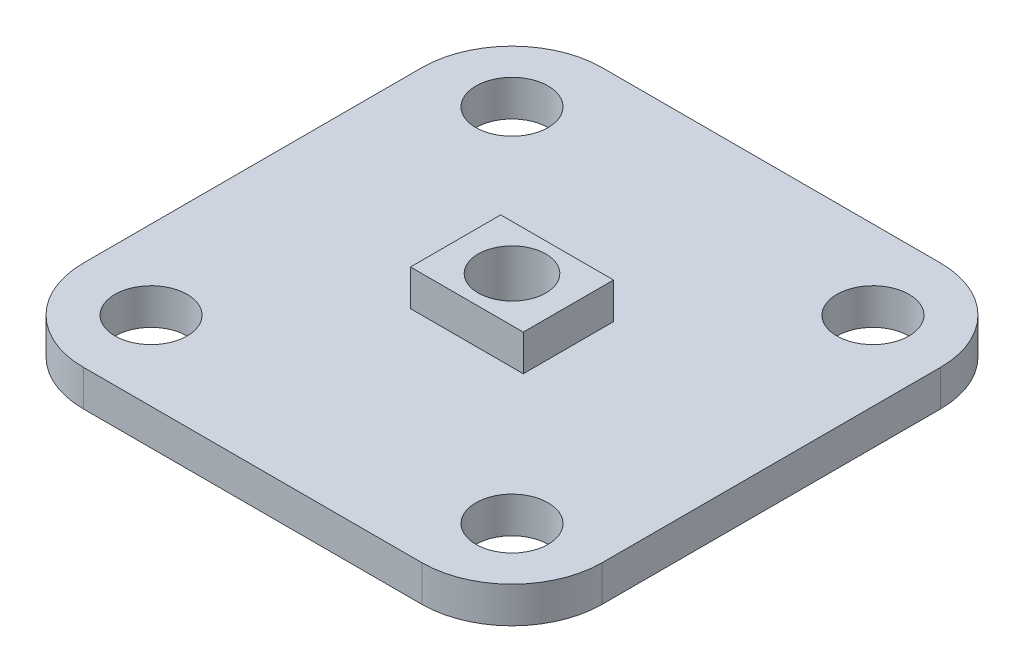
ISO-10303-21;
HEADER;
FILE_DESCRIPTION(('STEP AP214'),'2;1');
FILE_NAME('part.step','',(''),(''),'','','');
FILE_SCHEMA(('AUTOMOTIVE_DESIGN { 1 0 10303 214 1 1 1 1 }'));
ENDSEC;
DATA;
#1=APPLICATION_CONTEXT('core data for automotive mechanical design processes');
#2=APPLICATION_PROTOCOL_DEFINITION('international standard','automotive_design',2000,#1);
#3=PRODUCT_CONTEXT('',#1,'mechanical');
#4=PRODUCT('Part','Part','',(#3));
#5=PRODUCT_RELATED_PRODUCT_CATEGORY('part','',(#4));
#6=PRODUCT_DEFINITION_FORMATION('','',#4);
#7=PRODUCT_DEFINITION_CONTEXT('part definition',#1,'design');
#8=PRODUCT_DEFINITION('design','',#6,#7);
#9=PRODUCT_DEFINITION_SHAPE('','',#8);
#10=(LENGTH_UNIT() NAMED_UNIT(*) SI_UNIT(.MILLI.,.METRE.));
#11=(NAMED_UNIT(*) PLANE_ANGLE_UNIT() SI_UNIT($,.RADIAN.));
#12=(NAMED_UNIT(*) SI_UNIT($,.STERADIAN.) SOLID_ANGLE_UNIT());
#13=UNCERTAINTY_MEASURE_WITH_UNIT(LENGTH_MEASURE(1.E-05),#10,'distance_accuracy_value','');
#14=(GEOMETRIC_REPRESENTATION_CONTEXT(3) GLOBAL_UNCERTAINTY_ASSIGNED_CONTEXT((#13)) GLOBAL_UNIT_ASSIGNED_CONTEXT((#10,
#11,#12)) REPRESENTATION_CONTEXT('',''));
#15=CARTESIAN_POINT('',(0.,0.,0.));
#16=DIRECTION('',(0.,0.,1.));
#17=DIRECTION('',(1.,0.,0.));
#18=AXIS2_PLACEMENT_3D('',#15,#16,#17);
#19=CARTESIAN_POINT('',(0.,1.6,0.));
#20=DIRECTION('',(0.,-1.,0.));
#21=DIRECTION('',(0.,0.,-1.));
#22=AXIS2_PLACEMENT_3D('',#19,#20,#21);
#23=PLANE('',#22);
#24=CARTESIAN_POINT('',(-8.,1.6,-8.));
#25=DIRECTION('',(0.,-1.,0.));
#26=DIRECTION('',(0.,0.,-1.));
#27=AXIS2_PLACEMENT_3D('',#24,#25,#26);
#28=CIRCLE('',#27,1.60000000000011);
#29=CARTESIAN_POINT('',(-8.,1.6,-9.60000000000011));
#30=VERTEX_POINT('',#29);
#31=EDGE_CURVE('E490',#30,#30,#28,.F.);
#32=ORIENTED_EDGE('',*,*,#31,.F.);
#33=EDGE_LOOP('',(#32));
#34=FACE_BOUND('',#33,.T.);
#35=CARTESIAN_POINT('',(8.,1.6,-8.));
#36=DIRECTION('',(0.,-1.,0.));
#37=DIRECTION('',(0.,0.,-1.));
#38=AXIS2_PLACEMENT_3D('',#35,#36,#37);
#39=CIRCLE('',#38,1.60000000000007);
#40=CARTESIAN_POINT('',(8.,1.6,-9.60000000000007));
#41=VERTEX_POINT('',#40);
#42=EDGE_CURVE('E489',#41,#41,#39,.F.);
#43=ORIENTED_EDGE('',*,*,#42,.F.);
#44=EDGE_LOOP('',(#43));
#45=FACE_BOUND('',#44,.T.);
#46=CARTESIAN_POINT('',(8.,1.6,8.));
#47=DIRECTION('',(0.,-1.,0.));
#48=DIRECTION('',(0.,0.,-1.));
#49=AXIS2_PLACEMENT_3D('',#46,#47,#48);
#50=CIRCLE('',#49,1.60000000000004);
#51=CARTESIAN_POINT('',(8.,1.6,6.39999999999996));
#52=VERTEX_POINT('',#51);
#53=EDGE_CURVE('E497',#52,#52,#50,.F.);
#54=ORIENTED_EDGE('',*,*,#53,.F.);
#55=EDGE_LOOP('',(#54));
#56=FACE_BOUND('',#55,.T.);
#57=CARTESIAN_POINT('',(-8.,1.6,8.));
#58=DIRECTION('',(0.,-1.,0.));
#59=DIRECTION('',(0.,0.,-1.));
#60=AXIS2_PLACEMENT_3D('',#57,#58,#59);
#61=CIRCLE('',#60,1.6);
#62=CARTESIAN_POINT('',(-8.,1.6,6.4));
#63=VERTEX_POINT('',#62);
#64=EDGE_CURVE('E477',#63,#63,#61,.F.);
#65=ORIENTED_EDGE('',*,*,#64,.F.);
#66=EDGE_LOOP('',(#65));
#67=FACE_BOUND('',#66,.T.);
#68=DIRECTION('',(0.,0.,-1.));
#69=VECTOR('',#68,1.);
#70=CARTESIAN_POINT('',(11.5,1.6,11.5));
#71=LINE('',#70,#69);
#72=CARTESIAN_POINT('',(11.5,1.6,7.5));
#73=VERTEX_POINT('',#72);
#74=CARTESIAN_POINT('',(11.5,1.6,-7.5));
#75=VERTEX_POINT('',#74);
#76=EDGE_CURVE('E166',#73,#75,#71,.T.);
#77=ORIENTED_EDGE('',*,*,#76,.T.);
#78=CARTESIAN_POINT('',(7.5,1.6,-7.5));
#79=DIRECTION('',(0.,-1.,0.));
#80=DIRECTION('',(0.,0.,-1.));
#81=AXIS2_PLACEMENT_3D('',#78,#79,#80);
#82=CIRCLE('',#81,4.);
#83=CARTESIAN_POINT('',(7.5,1.6,-11.5));
#84=VERTEX_POINT('',#83);
#85=EDGE_CURVE('E206',#75,#84,#82,.F.);
#86=ORIENTED_EDGE('',*,*,#85,.T.);
#87=DIRECTION('',(-1.,0.,0.));
#88=VECTOR('',#87,1.);
#89=CARTESIAN_POINT('',(-11.5,1.6,-11.5));
#90=LINE('',#89,#88);
#91=CARTESIAN_POINT('',(-7.5,1.6,-11.5));
#92=VERTEX_POINT('',#91);
#93=EDGE_CURVE('E169',#84,#92,#90,.T.);
#94=ORIENTED_EDGE('',*,*,#93,.T.);
#95=CARTESIAN_POINT('',(-7.5,1.6,-7.5));
#96=DIRECTION('',(0.,-1.,0.));
#97=DIRECTION('',(0.,0.,-1.));
#98=AXIS2_PLACEMENT_3D('',#95,#96,#97);
#99=CIRCLE('',#98,4.);
#100=CARTESIAN_POINT('',(-11.5,1.6,-7.5));
#101=VERTEX_POINT('',#100);
#102=EDGE_CURVE('E204',#92,#101,#99,.F.);
#103=ORIENTED_EDGE('',*,*,#102,.T.);
#104=DIRECTION('',(0.,0.,1.));
#105=VECTOR('',#104,1.);
#106=CARTESIAN_POINT('',(-11.5,1.6,11.5));
#107=LINE('',#106,#105);
#108=CARTESIAN_POINT('',(-11.5,1.6,7.5));
#109=VERTEX_POINT('',#108);
#110=EDGE_CURVE('E173',#101,#109,#107,.T.);
#111=ORIENTED_EDGE('',*,*,#110,.T.);
#112=CARTESIAN_POINT('',(-7.5,1.6,7.5));
#113=DIRECTION('',(0.,-1.,0.));
#114=DIRECTION('',(0.,0.,-1.));
#115=AXIS2_PLACEMENT_3D('',#112,#113,#114);
#116=CIRCLE('',#115,4.);
#117=CARTESIAN_POINT('',(-7.5,1.6,11.5));
#118=VERTEX_POINT('',#117);
#119=EDGE_CURVE('E63',#109,#118,#116,.F.);
#120=ORIENTED_EDGE('',*,*,#119,.T.);
#121=DIRECTION('',(1.,0.,0.));
#122=VECTOR('',#121,1.);
#123=CARTESIAN_POINT('',(-11.5,1.6,11.5));
#124=LINE('',#123,#122);
#125=CARTESIAN_POINT('',(7.5,1.6,11.5));
#126=VERTEX_POINT('',#125);
#127=EDGE_CURVE('E175',#118,#126,#124,.T.);
#128=ORIENTED_EDGE('',*,*,#127,.T.);
#129=CARTESIAN_POINT('',(7.5,1.6,7.5));
#130=DIRECTION('',(0.,-1.,0.));
#131=DIRECTION('',(0.,0.,-1.));
#132=AXIS2_PLACEMENT_3D('',#129,#130,#131);
#133=CIRCLE('',#132,4.);
#134=EDGE_CURVE('E202',#126,#73,#133,.F.);
#135=ORIENTED_EDGE('',*,*,#134,.T.);
#136=EDGE_LOOP('',(#77,#86,#94,#103,#111,#120,#128,#135));
#137=FACE_BOUND('',#136,.T.);
#138=DIRECTION('',(0.,0.,-1.));
#139=VECTOR('',#138,1.);
#140=CARTESIAN_POINT('',(2.5,1.6,2.));
#141=LINE('',#140,#139);
#142=CARTESIAN_POINT('',(2.5,1.6,2.));
#143=VERTEX_POINT('',#142);
#144=CARTESIAN_POINT('',(2.5,1.6,-2.));
#145=VERTEX_POINT('',#144);
#146=EDGE_CURVE('E156',#143,#145,#141,.T.);
#147=ORIENTED_EDGE('',*,*,#146,.F.);
#148=DIRECTION('',(1.,0.,0.));
#149=VECTOR('',#148,1.);
#150=CARTESIAN_POINT('',(-2.5,1.6,2.));
#151=LINE('',#150,#149);
#152=CARTESIAN_POINT('',(-2.5,1.6,2.));
#153=VERTEX_POINT('',#152);
#154=EDGE_CURVE('E153',#153,#143,#151,.T.);
#155=ORIENTED_EDGE('',*,*,#154,.F.);
#156=DIRECTION('',(0.,0.,1.));
#157=VECTOR('',#156,1.);
#158=CARTESIAN_POINT('',(-2.5,1.6,2.));
#159=LINE('',#158,#157);
#160=CARTESIAN_POINT('',(-2.5,1.6,-2.));
#161=VERTEX_POINT('',#160);
#162=EDGE_CURVE('E466',#161,#153,#159,.T.);
#163=ORIENTED_EDGE('',*,*,#162,.F.);
#164=DIRECTION('',(-1.,0.,0.));
#165=VECTOR('',#164,1.);
#166=CARTESIAN_POINT('',(-2.5,1.6,-2.));
#167=LINE('',#166,#165);
#168=EDGE_CURVE('E468',#145,#161,#167,.T.);
#169=ORIENTED_EDGE('',*,*,#168,.F.);
#170=EDGE_LOOP('',(#147,#155,#163,#169));
#171=FACE_BOUND('',#170,.T.);
#172=ADVANCED_FACE('F43',(#34,#45,#56,#67,#137,#171),#23,.F.);
#173=CARTESIAN_POINT('',(11.5,1.6,11.5));
#174=DIRECTION('',(-1.,0.,0.));
#175=DIRECTION('',(0.,0.,1.));
#176=AXIS2_PLACEMENT_3D('',#173,#174,#175);
#177=PLANE('',#176);
#178=DIRECTION('',(0.,0.,-1.));
#179=VECTOR('',#178,1.);
#180=CARTESIAN_POINT('',(11.5,0.,11.5));
#181=LINE('',#180,#179);
#182=CARTESIAN_POINT('',(11.5,0.,7.5));
#183=VERTEX_POINT('',#182);
#184=CARTESIAN_POINT('',(11.5,0.,-7.5));
#185=VERTEX_POINT('',#184);
#186=EDGE_CURVE('E157',#183,#185,#181,.T.);
#187=ORIENTED_EDGE('',*,*,#186,.T.);
#188=DIRECTION('',(0.,-1.,0.));
#189=VECTOR('',#188,1.);
#190=CARTESIAN_POINT('',(11.5,1.6,-7.5));
#191=LINE('',#190,#189);
#192=EDGE_CURVE('E199',#185,#75,#191,.F.);
#193=ORIENTED_EDGE('',*,*,#192,.T.);
#194=ORIENTED_EDGE('',*,*,#76,.F.);
#195=DIRECTION('',(0.,-1.,0.));
#196=VECTOR('',#195,1.);
#197=CARTESIAN_POINT('',(11.5,1.6,7.5));
#198=LINE('',#197,#196);
#199=EDGE_CURVE('E196',#73,#183,#198,.T.);
#200=ORIENTED_EDGE('',*,*,#199,.T.);
#201=EDGE_LOOP('',(#187,#193,#194,#200));
#202=FACE_BOUND('',#201,.T.);
#203=ADVANCED_FACE('F228',(#202),#177,.F.);
#204=CARTESIAN_POINT('',(-11.5,1.6,-11.5));
#205=DIRECTION('',(0.,0.,1.));
#206=DIRECTION('',(1.,0.,0.));
#207=AXIS2_PLACEMENT_3D('',#204,#205,#206);
#208=PLANE('',#207);
#209=ORIENTED_EDGE('',*,*,#93,.F.);
#210=DIRECTION('',(0.,-1.,0.));
#211=VECTOR('',#210,1.);
#212=CARTESIAN_POINT('',(7.5,1.6,-11.5));
#213=LINE('',#212,#211);
#214=CARTESIAN_POINT('',(7.5,0.,-11.5));
#215=VERTEX_POINT('',#214);
#216=EDGE_CURVE('E185',#84,#215,#213,.T.);
#217=ORIENTED_EDGE('',*,*,#216,.T.);
#218=DIRECTION('',(-1.,0.,0.));
#219=VECTOR('',#218,1.);
#220=CARTESIAN_POINT('',(-11.5,0.,-11.5));
#221=LINE('',#220,#219);
#222=CARTESIAN_POINT('',(-7.5,0.,-11.5));
#223=VERTEX_POINT('',#222);
#224=EDGE_CURVE('E160',#215,#223,#221,.T.);
#225=ORIENTED_EDGE('',*,*,#224,.T.);
#226=DIRECTION('',(0.,-1.,0.));
#227=VECTOR('',#226,1.);
#228=CARTESIAN_POINT('',(-7.5,1.6,-11.5));
#229=LINE('',#228,#227);
#230=EDGE_CURVE('E176',#223,#92,#229,.F.);
#231=ORIENTED_EDGE('',*,*,#230,.T.);
#232=EDGE_LOOP('',(#209,#217,#225,#231));
#233=FACE_BOUND('',#232,.T.);
#234=ADVANCED_FACE('F237',(#233),#208,.F.);
#235=CARTESIAN_POINT('',(-11.5,1.6,11.5));
#236=DIRECTION('',(1.,0.,0.));
#237=DIRECTION('',(0.,0.,-1.));
#238=AXIS2_PLACEMENT_3D('',#235,#236,#237);
#239=PLANE('',#238);
#240=ORIENTED_EDGE('',*,*,#110,.F.);
#241=DIRECTION('',(0.,-1.,0.));
#242=VECTOR('',#241,1.);
#243=CARTESIAN_POINT('',(-11.5,1.6,-7.5));
#244=LINE('',#243,#242);
#245=CARTESIAN_POINT('',(-11.5,0.,-7.5));
#246=VERTEX_POINT('',#245);
#247=EDGE_CURVE('E210',#101,#246,#244,.T.);
#248=ORIENTED_EDGE('',*,*,#247,.T.);
#249=DIRECTION('',(0.,0.,1.));
#250=VECTOR('',#249,1.);
#251=CARTESIAN_POINT('',(-11.5,0.,11.5));
#252=LINE('',#251,#250);
#253=CARTESIAN_POINT('',(-11.5,0.,7.5));
#254=VERTEX_POINT('',#253);
#255=EDGE_CURVE('E180',#246,#254,#252,.T.);
#256=ORIENTED_EDGE('',*,*,#255,.T.);
#257=DIRECTION('',(0.,-1.,0.));
#258=VECTOR('',#257,1.);
#259=CARTESIAN_POINT('',(-11.5,1.6,7.5));
#260=LINE('',#259,#258);
#261=EDGE_CURVE('E208',#254,#109,#260,.F.);
#262=ORIENTED_EDGE('',*,*,#261,.T.);
#263=EDGE_LOOP('',(#240,#248,#256,#262));
#264=FACE_BOUND('',#263,.T.);
#265=ADVANCED_FACE('F245',(#264),#239,.F.);
#266=CARTESIAN_POINT('',(-11.5,1.6,11.5));
#267=DIRECTION('',(0.,0.,-1.));
#268=DIRECTION('',(-1.,0.,0.));
#269=AXIS2_PLACEMENT_3D('',#266,#267,#268);
#270=PLANE('',#269);
#271=DIRECTION('',(1.,0.,0.));
#272=VECTOR('',#271,1.);
#273=CARTESIAN_POINT('',(-11.5,0.,11.5));
#274=LINE('',#273,#272);
#275=CARTESIAN_POINT('',(-7.5,0.,11.5));
#276=VERTEX_POINT('',#275);
#277=CARTESIAN_POINT('',(7.5,0.,11.5));
#278=VERTEX_POINT('',#277);
#279=EDGE_CURVE('E170',#276,#278,#274,.T.);
#280=ORIENTED_EDGE('',*,*,#279,.T.);
#281=DIRECTION('',(0.,-1.,0.));
#282=VECTOR('',#281,1.);
#283=CARTESIAN_POINT('',(7.5,1.6,11.5));
#284=LINE('',#283,#282);
#285=EDGE_CURVE('E11',#278,#126,#284,.F.);
#286=ORIENTED_EDGE('',*,*,#285,.T.);
#287=ORIENTED_EDGE('',*,*,#127,.F.);
#288=DIRECTION('',(0.,-1.,0.));
#289=VECTOR('',#288,1.);
#290=CARTESIAN_POINT('',(-7.5,1.6,11.5));
#291=LINE('',#290,#289);
#292=EDGE_CURVE('E51',#118,#276,#291,.T.);
#293=ORIENTED_EDGE('',*,*,#292,.T.);
#294=EDGE_LOOP('',(#280,#286,#287,#293));
#295=FACE_BOUND('',#294,.T.);
#296=ADVANCED_FACE('F215',(#295),#270,.F.);
#297=CARTESIAN_POINT('',(0.,0.,0.));
#298=DIRECTION('',(0.,-1.,0.));
#299=DIRECTION('',(0.,0.,-1.));
#300=AXIS2_PLACEMENT_3D('',#297,#298,#299);
#301=PLANE('',#300);
#302=CARTESIAN_POINT('',(0.,0.,0.));
#303=DIRECTION('',(0.,-1.,0.));
#304=DIRECTION('',(0.,0.,-1.));
#305=AXIS2_PLACEMENT_3D('',#302,#303,#304);
#306=CIRCLE('',#305,1.5);
#307=CARTESIAN_POINT('',(0.,0.,-1.5));
#308=VERTEX_POINT('',#307);
#309=EDGE_CURVE('E506',#308,#308,#306,.T.);
#310=ORIENTED_EDGE('',*,*,#309,.F.);
#311=EDGE_LOOP('',(#310));
#312=FACE_BOUND('',#311,.T.);
#313=CARTESIAN_POINT('',(-8.,0.,-8.));
#314=DIRECTION('',(0.,-1.,0.));
#315=DIRECTION('',(0.,0.,-1.));
#316=AXIS2_PLACEMENT_3D('',#313,#314,#315);
#317=CIRCLE('',#316,1.60000000000011);
#318=CARTESIAN_POINT('',(-8.,0.,-9.60000000000011));
#319=VERTEX_POINT('',#318);
#320=EDGE_CURVE('E486',#319,#319,#317,.T.);
#321=ORIENTED_EDGE('',*,*,#320,.F.);
#322=EDGE_LOOP('',(#321));
#323=FACE_BOUND('',#322,.T.);
#324=CARTESIAN_POINT('',(8.,0.,-8.));
#325=DIRECTION('',(0.,-1.,0.));
#326=DIRECTION('',(0.,0.,-1.));
#327=AXIS2_PLACEMENT_3D('',#324,#325,#326);
#328=CIRCLE('',#327,1.60000000000007);
#329=CARTESIAN_POINT('',(8.,0.,-9.60000000000007));
#330=VERTEX_POINT('',#329);
#331=EDGE_CURVE('E494',#330,#330,#328,.T.);
#332=ORIENTED_EDGE('',*,*,#331,.F.);
#333=EDGE_LOOP('',(#332));
#334=FACE_BOUND('',#333,.T.);
#335=CARTESIAN_POINT('',(8.,0.,8.));
#336=DIRECTION('',(0.,-1.,0.));
#337=DIRECTION('',(0.,0.,-1.));
#338=AXIS2_PLACEMENT_3D('',#335,#336,#337);
#339=CIRCLE('',#338,1.60000000000004);
#340=CARTESIAN_POINT('',(8.,0.,6.39999999999996));
#341=VERTEX_POINT('',#340);
#342=EDGE_CURVE('E485',#341,#341,#339,.T.);
#343=ORIENTED_EDGE('',*,*,#342,.F.);
#344=EDGE_LOOP('',(#343));
#345=FACE_BOUND('',#344,.T.);
#346=CARTESIAN_POINT('',(-8.,0.,8.));
#347=DIRECTION('',(0.,-1.,0.));
#348=DIRECTION('',(0.,0.,-1.));
#349=AXIS2_PLACEMENT_3D('',#346,#347,#348);
#350=CIRCLE('',#349,1.6);
#351=CARTESIAN_POINT('',(-8.,0.,6.4));
#352=VERTEX_POINT('',#351);
#353=EDGE_CURVE('E482',#352,#352,#350,.T.);
#354=ORIENTED_EDGE('',*,*,#353,.F.);
#355=EDGE_LOOP('',(#354));
#356=FACE_BOUND('',#355,.T.);
#357=ORIENTED_EDGE('',*,*,#224,.F.);
#358=CARTESIAN_POINT('',(7.5,0.,-7.5));
#359=DIRECTION('',(0.,-1.,0.));
#360=DIRECTION('',(0.,0.,-1.));
#361=AXIS2_PLACEMENT_3D('',#358,#359,#360);
#362=CIRCLE('',#361,4.);
#363=EDGE_CURVE('E194',#215,#185,#362,.T.);
#364=ORIENTED_EDGE('',*,*,#363,.T.);
#365=ORIENTED_EDGE('',*,*,#186,.F.);
#366=CARTESIAN_POINT('',(7.5,0.,7.5));
#367=DIRECTION('',(0.,-1.,0.));
#368=DIRECTION('',(0.,0.,-1.));
#369=AXIS2_PLACEMENT_3D('',#366,#367,#368);
#370=CIRCLE('',#369,4.);
#371=EDGE_CURVE('E190',#183,#278,#370,.T.);
#372=ORIENTED_EDGE('',*,*,#371,.T.);
#373=ORIENTED_EDGE('',*,*,#279,.F.);
#374=CARTESIAN_POINT('',(-7.5,0.,7.5));
#375=DIRECTION('',(0.,-1.,0.));
#376=DIRECTION('',(0.,0.,-1.));
#377=AXIS2_PLACEMENT_3D('',#374,#375,#376);
#378=CIRCLE('',#377,4.);
#379=EDGE_CURVE('E188',#276,#254,#378,.T.);
#380=ORIENTED_EDGE('',*,*,#379,.T.);
#381=ORIENTED_EDGE('',*,*,#255,.F.);
#382=CARTESIAN_POINT('',(-7.5,0.,-7.5));
#383=DIRECTION('',(0.,-1.,0.));
#384=DIRECTION('',(0.,0.,-1.));
#385=AXIS2_PLACEMENT_3D('',#382,#383,#384);
#386=CIRCLE('',#385,4.);
#387=EDGE_CURVE('E192',#246,#223,#386,.T.);
#388=ORIENTED_EDGE('',*,*,#387,.T.);
#389=EDGE_LOOP('',(#357,#364,#365,#372,#373,#380,#381,#388));
#390=FACE_BOUND('',#389,.T.);
#391=ADVANCED_FACE('F219',(#312,#323,#334,#345,#356,#390),#301,.T.);
#392=CARTESIAN_POINT('',(2.5,3.2,2.));
#393=DIRECTION('',(-1.,0.,0.));
#394=DIRECTION('',(0.,0.,1.));
#395=AXIS2_PLACEMENT_3D('',#392,#393,#394);
#396=PLANE('',#395);
#397=ORIENTED_EDGE('',*,*,#146,.T.);
#398=DIRECTION('',(0.,-1.,0.));
#399=VECTOR('',#398,1.);
#400=CARTESIAN_POINT('',(2.5,3.2,-2.));
#401=LINE('',#400,#399);
#402=CARTESIAN_POINT('',(2.5,3.2,-2.));
#403=VERTEX_POINT('',#402);
#404=EDGE_CURVE('E137',#403,#145,#401,.T.);
#405=ORIENTED_EDGE('',*,*,#404,.F.);
#406=DIRECTION('',(0.,0.,-1.));
#407=VECTOR('',#406,1.);
#408=CARTESIAN_POINT('',(2.5,3.2,2.));
#409=LINE('',#408,#407);
#410=CARTESIAN_POINT('',(2.5,3.2,2.));
#411=VERTEX_POINT('',#410);
#412=EDGE_CURVE('E144',#411,#403,#409,.T.);
#413=ORIENTED_EDGE('',*,*,#412,.F.);
#414=DIRECTION('',(0.,-1.,0.));
#415=VECTOR('',#414,1.);
#416=CARTESIAN_POINT('',(2.5,3.2,2.));
#417=LINE('',#416,#415);
#418=EDGE_CURVE('E471',#411,#143,#417,.T.);
#419=ORIENTED_EDGE('',*,*,#418,.T.);
#420=EDGE_LOOP('',(#397,#405,#413,#419));
#421=FACE_BOUND('',#420,.T.);
#422=ADVANCED_FACE('F155',(#421),#396,.F.);
#423=CARTESIAN_POINT('',(-2.5,3.2,-2.));
#424=DIRECTION('',(0.,0.,1.));
#425=DIRECTION('',(1.,0.,0.));
#426=AXIS2_PLACEMENT_3D('',#423,#424,#425);
#427=PLANE('',#426);
#428=ORIENTED_EDGE('',*,*,#168,.T.);
#429=DIRECTION('',(0.,-1.,0.));
#430=VECTOR('',#429,1.);
#431=CARTESIAN_POINT('',(-2.5,3.2,-2.));
#432=LINE('',#431,#430);
#433=CARTESIAN_POINT('',(-2.5,3.2,-2.));
#434=VERTEX_POINT('',#433);
#435=EDGE_CURVE('E140',#434,#161,#432,.T.);
#436=ORIENTED_EDGE('',*,*,#435,.F.);
#437=DIRECTION('',(-1.,0.,0.));
#438=VECTOR('',#437,1.);
#439=CARTESIAN_POINT('',(-2.5,3.2,-2.));
#440=LINE('',#439,#438);
#441=EDGE_CURVE('E132',#403,#434,#440,.T.);
#442=ORIENTED_EDGE('',*,*,#441,.F.);
#443=ORIENTED_EDGE('',*,*,#404,.T.);
#444=EDGE_LOOP('',(#428,#436,#442,#443));
#445=FACE_BOUND('',#444,.T.);
#446=ADVANCED_FACE('F135',(#445),#427,.F.);
#447=CARTESIAN_POINT('',(-2.5,3.2,2.));
#448=DIRECTION('',(1.,0.,0.));
#449=DIRECTION('',(0.,0.,-1.));
#450=AXIS2_PLACEMENT_3D('',#447,#448,#449);
#451=PLANE('',#450);
#452=ORIENTED_EDGE('',*,*,#162,.T.);
#453=DIRECTION('',(0.,-1.,0.));
#454=VECTOR('',#453,1.);
#455=CARTESIAN_POINT('',(-2.5,3.2,2.));
#456=LINE('',#455,#454);
#457=CARTESIAN_POINT('',(-2.5,3.2,2.));
#458=VERTEX_POINT('',#457);
#459=EDGE_CURVE('E162',#458,#153,#456,.T.);
#460=ORIENTED_EDGE('',*,*,#459,.F.);
#461=DIRECTION('',(0.,0.,1.));
#462=VECTOR('',#461,1.);
#463=CARTESIAN_POINT('',(-2.5,3.2,2.));
#464=LINE('',#463,#462);
#465=EDGE_CURVE('E143',#434,#458,#464,.T.);
#466=ORIENTED_EDGE('',*,*,#465,.F.);
#467=ORIENTED_EDGE('',*,*,#435,.T.);
#468=EDGE_LOOP('',(#452,#460,#466,#467));
#469=FACE_BOUND('',#468,.T.);
#470=ADVANCED_FACE('F392',(#469),#451,.F.);
#471=CARTESIAN_POINT('',(-2.5,3.2,2.));
#472=DIRECTION('',(0.,0.,-1.));
#473=DIRECTION('',(-1.,0.,0.));
#474=AXIS2_PLACEMENT_3D('',#471,#472,#473);
#475=PLANE('',#474);
#476=ORIENTED_EDGE('',*,*,#154,.T.);
#477=ORIENTED_EDGE('',*,*,#418,.F.);
#478=DIRECTION('',(1.,0.,0.));
#479=VECTOR('',#478,1.);
#480=CARTESIAN_POINT('',(-2.5,3.2,2.));
#481=LINE('',#480,#479);
#482=EDGE_CURVE('E149',#458,#411,#481,.T.);
#483=ORIENTED_EDGE('',*,*,#482,.F.);
#484=ORIENTED_EDGE('',*,*,#459,.T.);
#485=EDGE_LOOP('',(#476,#477,#483,#484));
#486=FACE_BOUND('',#485,.T.);
#487=ADVANCED_FACE('F355',(#486),#475,.F.);
#488=CARTESIAN_POINT('',(0.,3.2,0.));
#489=DIRECTION('',(0.,-1.,0.));
#490=DIRECTION('',(0.,0.,-1.));
#491=AXIS2_PLACEMENT_3D('',#488,#489,#490);
#492=PLANE('',#491);
#493=CARTESIAN_POINT('',(0.,3.2,0.));
#494=DIRECTION('',(0.,-1.,0.));
#495=DIRECTION('',(0.,0.,-1.));
#496=AXIS2_PLACEMENT_3D('',#493,#494,#495);
#497=CIRCLE('',#496,1.5);
#498=CARTESIAN_POINT('',(0.,3.2,-1.5));
#499=VERTEX_POINT('',#498);
#500=EDGE_CURVE('E493',#499,#499,#497,.F.);
#501=ORIENTED_EDGE('',*,*,#500,.F.);
#502=EDGE_LOOP('',(#501));
#503=FACE_BOUND('',#502,.T.);
#504=ORIENTED_EDGE('',*,*,#412,.T.);
#505=ORIENTED_EDGE('',*,*,#441,.T.);
#506=ORIENTED_EDGE('',*,*,#465,.T.);
#507=ORIENTED_EDGE('',*,*,#482,.T.);
#508=EDGE_LOOP('',(#504,#505,#506,#507));
#509=FACE_BOUND('',#508,.T.);
#510=ADVANCED_FACE('F147',(#503,#509),#492,.F.);
#511=CARTESIAN_POINT('',(7.5,1.6,-7.5));
#512=DIRECTION('',(0.,-1.,0.));
#513=DIRECTION('',(0.,0.,-1.));
#514=AXIS2_PLACEMENT_3D('',#511,#512,#513);
#515=CYLINDRICAL_SURFACE('',#514,4.);
#516=ORIENTED_EDGE('',*,*,#85,.F.);
#517=ORIENTED_EDGE('',*,*,#192,.F.);
#518=ORIENTED_EDGE('',*,*,#363,.F.);
#519=ORIENTED_EDGE('',*,*,#216,.F.);
#520=EDGE_LOOP('',(#516,#517,#518,#519));
#521=FACE_BOUND('',#520,.T.);
#522=ADVANCED_FACE('F235',(#521),#515,.T.);
#523=CARTESIAN_POINT('',(-7.5,1.6,-7.5));
#524=DIRECTION('',(0.,-1.,0.));
#525=DIRECTION('',(0.,0.,-1.));
#526=AXIS2_PLACEMENT_3D('',#523,#524,#525);
#527=CYLINDRICAL_SURFACE('',#526,4.);
#528=ORIENTED_EDGE('',*,*,#102,.F.);
#529=ORIENTED_EDGE('',*,*,#230,.F.);
#530=ORIENTED_EDGE('',*,*,#387,.F.);
#531=ORIENTED_EDGE('',*,*,#247,.F.);
#532=EDGE_LOOP('',(#528,#529,#530,#531));
#533=FACE_BOUND('',#532,.T.);
#534=ADVANCED_FACE('F242',(#533),#527,.T.);
#535=CARTESIAN_POINT('',(7.5,1.6,7.5));
#536=DIRECTION('',(0.,-1.,0.));
#537=DIRECTION('',(0.,0.,-1.));
#538=AXIS2_PLACEMENT_3D('',#535,#536,#537);
#539=CYLINDRICAL_SURFACE('',#538,4.);
#540=ORIENTED_EDGE('',*,*,#134,.F.);
#541=ORIENTED_EDGE('',*,*,#285,.F.);
#542=ORIENTED_EDGE('',*,*,#371,.F.);
#543=ORIENTED_EDGE('',*,*,#199,.F.);
#544=EDGE_LOOP('',(#540,#541,#542,#543));
#545=FACE_BOUND('',#544,.T.);
#546=ADVANCED_FACE('F225',(#545),#539,.T.);
#547=CARTESIAN_POINT('',(-7.5,1.6,7.5));
#548=DIRECTION('',(0.,-1.,0.));
#549=DIRECTION('',(0.,0.,-1.));
#550=AXIS2_PLACEMENT_3D('',#547,#548,#549);
#551=CYLINDRICAL_SURFACE('',#550,4.);
#552=ORIENTED_EDGE('',*,*,#119,.F.);
#553=ORIENTED_EDGE('',*,*,#261,.F.);
#554=ORIENTED_EDGE('',*,*,#379,.F.);
#555=ORIENTED_EDGE('',*,*,#292,.F.);
#556=EDGE_LOOP('',(#552,#553,#554,#555));
#557=FACE_BOUND('',#556,.T.);
#558=ADVANCED_FACE('F45',(#557),#551,.T.);
#559=CARTESIAN_POINT('',(-8.,3.201,8.));
#560=DIRECTION('',(0.,-1.,0.));
#561=DIRECTION('',(0.,0.,-1.));
#562=AXIS2_PLACEMENT_3D('',#559,#560,#561);
#563=CYLINDRICAL_SURFACE('',#562,1.6);
#564=ORIENTED_EDGE('',*,*,#353,.T.);
#565=EDGE_LOOP('',(#564));
#566=FACE_BOUND('',#565,.T.);
#567=ORIENTED_EDGE('',*,*,#64,.T.);
#568=EDGE_LOOP('',(#567));
#569=FACE_BOUND('',#568,.T.);
#570=ADVANCED_FACE('F248',(#566,#569),#563,.F.);
#571=CARTESIAN_POINT('',(8.,3.201,8.));
#572=DIRECTION('',(0.,-1.,0.));
#573=DIRECTION('',(0.,0.,-1.));
#574=AXIS2_PLACEMENT_3D('',#571,#572,#573);
#575=CYLINDRICAL_SURFACE('',#574,1.60000000000004);
#576=ORIENTED_EDGE('',*,*,#342,.T.);
#577=EDGE_LOOP('',(#576));
#578=FACE_BOUND('',#577,.T.);
#579=ORIENTED_EDGE('',*,*,#53,.T.);
#580=EDGE_LOOP('',(#579));
#581=FACE_BOUND('',#580,.T.);
#582=ADVANCED_FACE('F253',(#578,#581),#575,.F.);
#583=CARTESIAN_POINT('',(8.,3.201,-8.));
#584=DIRECTION('',(0.,-1.,0.));
#585=DIRECTION('',(0.,0.,-1.));
#586=AXIS2_PLACEMENT_3D('',#583,#584,#585);
#587=CYLINDRICAL_SURFACE('',#586,1.60000000000007);
#588=ORIENTED_EDGE('',*,*,#331,.T.);
#589=EDGE_LOOP('',(#588));
#590=FACE_BOUND('',#589,.T.);
#591=ORIENTED_EDGE('',*,*,#42,.T.);
#592=EDGE_LOOP('',(#591));
#593=FACE_BOUND('',#592,.T.);
#594=ADVANCED_FACE('F317',(#590,#593),#587,.F.);
#595=CARTESIAN_POINT('',(-8.,3.201,-8.));
#596=DIRECTION('',(0.,-1.,0.));
#597=DIRECTION('',(0.,0.,-1.));
#598=AXIS2_PLACEMENT_3D('',#595,#596,#597);
#599=CYLINDRICAL_SURFACE('',#598,1.60000000000011);
#600=ORIENTED_EDGE('',*,*,#320,.T.);
#601=EDGE_LOOP('',(#600));
#602=FACE_BOUND('',#601,.T.);
#603=ORIENTED_EDGE('',*,*,#31,.T.);
#604=EDGE_LOOP('',(#603));
#605=FACE_BOUND('',#604,.T.);
#606=ADVANCED_FACE('F328',(#602,#605),#599,.F.);
#607=CARTESIAN_POINT('',(0.,3.201,0.));
#608=DIRECTION('',(0.,-1.,0.));
#609=DIRECTION('',(0.,0.,-1.));
#610=AXIS2_PLACEMENT_3D('',#607,#608,#609);
#611=CYLINDRICAL_SURFACE('',#610,1.5);
#612=ORIENTED_EDGE('',*,*,#309,.T.);
#613=EDGE_LOOP('',(#612));
#614=FACE_BOUND('',#613,.T.);
#615=ORIENTED_EDGE('',*,*,#500,.T.);
#616=EDGE_LOOP('',(#615));
#617=FACE_BOUND('',#616,.T.);
#618=ADVANCED_FACE('F338',(#614,#617),#611,.F.);
#619=CLOSED_SHELL('',(#172,#203,#234,#265,#296,#391,#422,#446,#470,#487,#510,#522,#534,#546,
#558,#570,#582,#594,#606,#618));
#620=MANIFOLD_SOLID_BREP('B2',#619);
#621=ADVANCED_BREP_SHAPE_REPRESENTATION('',(#18,#620),#14);
#622=SHAPE_DEFINITION_REPRESENTATION(#9,#621);
ENDSEC;
END-ISO-10303-21;
